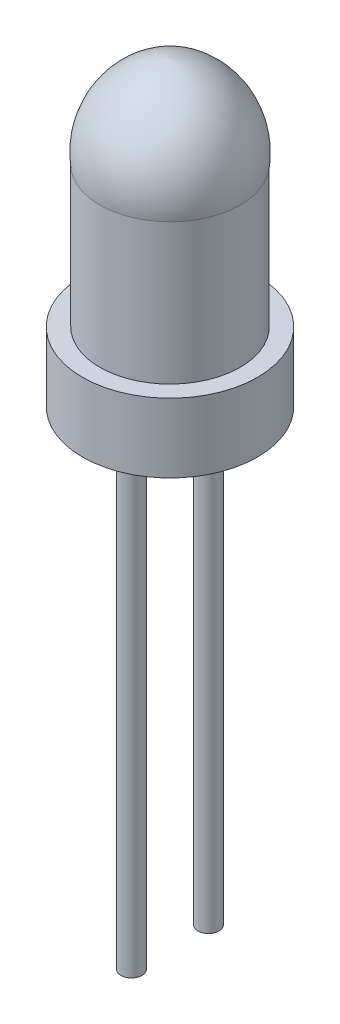
ISO-10303-21;
HEADER;
FILE_DESCRIPTION(('STEP AP214'),'2;1');
FILE_NAME('part.step','',(''),(''),'','','');
FILE_SCHEMA(('AUTOMOTIVE_DESIGN { 1 0 10303 214 1 1 1 1 }'));
ENDSEC;
DATA;
#1=APPLICATION_CONTEXT('core data for automotive mechanical design processes');
#2=APPLICATION_PROTOCOL_DEFINITION('international standard','automotive_design',2000,#1);
#3=PRODUCT_CONTEXT('',#1,'mechanical');
#4=PRODUCT('Part','Part','',(#3));
#5=PRODUCT_RELATED_PRODUCT_CATEGORY('part','',(#4));
#6=PRODUCT_DEFINITION_FORMATION('','',#4);
#7=PRODUCT_DEFINITION_CONTEXT('part definition',#1,'design');
#8=PRODUCT_DEFINITION('design','',#6,#7);
#9=PRODUCT_DEFINITION_SHAPE('','',#8);
#10=(LENGTH_UNIT() NAMED_UNIT(*) SI_UNIT(.MILLI.,.METRE.));
#11=(NAMED_UNIT(*) PLANE_ANGLE_UNIT() SI_UNIT($,.RADIAN.));
#12=(NAMED_UNIT(*) SI_UNIT($,.STERADIAN.) SOLID_ANGLE_UNIT());
#13=UNCERTAINTY_MEASURE_WITH_UNIT(LENGTH_MEASURE(1.E-05),#10,'distance_accuracy_value','');
#14=(GEOMETRIC_REPRESENTATION_CONTEXT(3) GLOBAL_UNCERTAINTY_ASSIGNED_CONTEXT((#13)) GLOBAL_UNIT_ASSIGNED_CONTEXT((#10,
#11,#12)) REPRESENTATION_CONTEXT('',''));
#15=CARTESIAN_POINT('',(0.,0.,0.));
#16=DIRECTION('',(0.,0.,1.));
#17=DIRECTION('',(1.,0.,0.));
#18=AXIS2_PLACEMENT_3D('',#15,#16,#17);
#19=CARTESIAN_POINT('',(0.,0.,0.));
#20=DIRECTION('',(0.,-1.,0.));
#21=DIRECTION('',(0.,0.,-1.));
#22=AXIS2_PLACEMENT_3D('',#19,#20,#21);
#23=PLANE('',#22);
#24=CARTESIAN_POINT('',(0.,0.,0.822285038665882));
#25=DIRECTION('',(0.,-1.,0.));
#26=DIRECTION('',(0.,0.,1.));
#27=AXIS2_PLACEMENT_3D('',#24,#25,#26);
#28=CIRCLE('',#27,0.225118875903263);
#29=CARTESIAN_POINT('',(0.,0.,1.04740391456914));
#30=VERTEX_POINT('',#29);
#31=EDGE_CURVE('E83',#30,#30,#28,.T.);
#32=ORIENTED_EDGE('',*,*,#31,.F.);
#33=EDGE_LOOP('',(#32));
#34=FACE_BOUND('',#33,.T.);
#35=CARTESIAN_POINT('',(0.,0.,-0.822285038665882));
#36=DIRECTION('',(0.,-1.,0.));
#37=DIRECTION('',(0.,0.,-1.));
#38=AXIS2_PLACEMENT_3D('',#35,#36,#37);
#39=CIRCLE('',#38,0.225118875903263);
#40=CARTESIAN_POINT('',(0.,0.,-1.04740391456914));
#41=VERTEX_POINT('',#40);
#42=EDGE_CURVE('E75',#41,#41,#39,.T.);
#43=ORIENTED_EDGE('',*,*,#42,.F.);
#44=EDGE_LOOP('',(#43));
#45=FACE_BOUND('',#44,.T.);
#46=CARTESIAN_POINT('',(0.,0.,0.));
#47=DIRECTION('',(0.,-1.,0.));
#48=DIRECTION('',(0.,0.,-1.));
#49=AXIS2_PLACEMENT_3D('',#46,#47,#48);
#50=CIRCLE('',#49,1.87);
#51=CARTESIAN_POINT('',(0.,0.,-1.87));
#52=VERTEX_POINT('',#51);
#53=EDGE_CURVE('E68',#52,#52,#50,.T.);
#54=ORIENTED_EDGE('',*,*,#53,.T.);
#55=EDGE_LOOP('',(#54));
#56=FACE_BOUND('',#55,.T.);
#57=ADVANCED_FACE('F41',(#34,#45,#56),#23,.T.);
#58=CARTESIAN_POINT('',(0.,4.69893397912577,0.22363052942277));
#59=DIRECTION('',(-1.,0.,0.));
#60=DIRECTION('',(0.,0.,-1.));
#61=AXIS2_PLACEMENT_3D('',#58,#59,#60);
#62=CIRCLE('',#61,1.73807733304595);
#63=TRIMMED_CURVE('',#62,(PARAMETER_VALUE(-1.44177318488154)),
(PARAMETER_VALUE(1.44177318488154)),.T.,.PARAMETER.);
#64=CARTESIAN_POINT('',(0.,4.69893397912577,0.));
#65=DIRECTION('',(0.,-1.,0.));
#66=AXIS1_PLACEMENT('',#64,#65);
#67=SURFACE_OF_REVOLUTION('',#63,#66);
#68=CARTESIAN_POINT('',(0.,6.42256450854854,0.));
#69=VERTEX_POINT('',#68);
#70=VERTEX_LOOP('',#69);
#71=FACE_BOUND('',#70,.T.);
#72=CARTESIAN_POINT('',(0.,4.475303449703,0.));
#73=DIRECTION('',(0.,-1.,0.));
#74=DIRECTION('',(0.,0.,-1.));
#75=AXIS2_PLACEMENT_3D('',#72,#73,#74);
#76=CIRCLE('',#75,1.5);
#77=CARTESIAN_POINT('',(0.,4.475303449703,-1.5));
#78=VERTEX_POINT('',#77);
#79=EDGE_CURVE('E11',#78,#78,#76,.T.);
#80=ORIENTED_EDGE('',*,*,#79,.F.);
#81=EDGE_LOOP('',(#80));
#82=FACE_BOUND('',#81,.T.);
#83=ADVANCED_FACE('F51',(#71,#82),#67,.T.);
#84=CARTESIAN_POINT('',(0.,0.,0.));
#85=DIRECTION('',(0.,-1.,0.));
#86=DIRECTION('',(0.,0.,-1.));
#87=AXIS2_PLACEMENT_3D('',#84,#85,#86);
#88=CYLINDRICAL_SURFACE('',#87,1.5);
#89=ORIENTED_EDGE('',*,*,#79,.T.);
#90=EDGE_LOOP('',(#89));
#91=FACE_BOUND('',#90,.T.);
#92=CARTESIAN_POINT('',(0.,1.475303449703,0.));
#93=DIRECTION('',(0.,-1.,0.));
#94=DIRECTION('',(0.,0.,-1.));
#95=AXIS2_PLACEMENT_3D('',#92,#93,#94);
#96=CIRCLE('',#95,1.5);
#97=CARTESIAN_POINT('',(0.,1.475303449703,-1.5));
#98=VERTEX_POINT('',#97);
#99=EDGE_CURVE('E48',#98,#98,#96,.T.);
#100=ORIENTED_EDGE('',*,*,#99,.F.);
#101=EDGE_LOOP('',(#100));
#102=FACE_BOUND('',#101,.T.);
#103=ADVANCED_FACE('F54',(#91,#102),#88,.T.);
#104=CARTESIAN_POINT('',(1.87,1.475303449703,0.));
#105=DIRECTION('',(0.,1.,0.));
#106=DIRECTION('',(0.,0.,1.));
#107=AXIS2_PLACEMENT_3D('',#104,#105,#106);
#108=PLANE('',#107);
#109=ORIENTED_EDGE('',*,*,#99,.T.);
#110=EDGE_LOOP('',(#109));
#111=FACE_BOUND('',#110,.T.);
#112=CARTESIAN_POINT('',(0.,1.475303449703,0.));
#113=DIRECTION('',(0.,-1.,0.));
#114=DIRECTION('',(0.,0.,-1.));
#115=AXIS2_PLACEMENT_3D('',#112,#113,#114);
#116=CIRCLE('',#115,1.87);
#117=CARTESIAN_POINT('',(0.,1.475303449703,-1.87));
#118=VERTEX_POINT('',#117);
#119=EDGE_CURVE('E65',#118,#118,#116,.T.);
#120=ORIENTED_EDGE('',*,*,#119,.F.);
#121=EDGE_LOOP('',(#120));
#122=FACE_BOUND('',#121,.T.);
#123=ADVANCED_FACE('F59',(#111,#122),#108,.T.);
#124=CARTESIAN_POINT('',(0.,0.,0.));
#125=DIRECTION('',(0.,-1.,0.));
#126=DIRECTION('',(0.,0.,-1.));
#127=AXIS2_PLACEMENT_3D('',#124,#125,#126);
#128=CYLINDRICAL_SURFACE('',#127,1.87);
#129=ORIENTED_EDGE('',*,*,#119,.T.);
#130=EDGE_LOOP('',(#129));
#131=FACE_BOUND('',#130,.T.);
#132=ORIENTED_EDGE('',*,*,#53,.F.);
#133=EDGE_LOOP('',(#132));
#134=FACE_BOUND('',#133,.T.);
#135=ADVANCED_FACE('F106',(#131,#134),#128,.T.);
#136=CARTESIAN_POINT('',(0.,-10.,-0.822285038665882));
#137=DIRECTION('',(0.,1.,0.));
#138=DIRECTION('',(0.,0.,1.));
#139=AXIS2_PLACEMENT_3D('',#136,#137,#138);
#140=CYLINDRICAL_SURFACE('',#139,0.225118875903263);
#141=CARTESIAN_POINT('',(0.,-10.,-0.822285038665882));
#142=DIRECTION('',(0.,-1.,0.));
#143=DIRECTION('',(0.,0.,-1.));
#144=AXIS2_PLACEMENT_3D('',#141,#142,#143);
#145=CIRCLE('',#144,0.225118875903263);
#146=CARTESIAN_POINT('',(0.,-10.,-1.04740391456914));
#147=VERTEX_POINT('',#146);
#148=EDGE_CURVE('E74',#147,#147,#145,.T.);
#149=ORIENTED_EDGE('',*,*,#148,.F.);
#150=EDGE_LOOP('',(#149));
#151=FACE_BOUND('',#150,.T.);
#152=ORIENTED_EDGE('',*,*,#42,.T.);
#153=EDGE_LOOP('',(#152));
#154=FACE_BOUND('',#153,.T.);
#155=ADVANCED_FACE('F108',(#151,#154),#140,.T.);
#156=CARTESIAN_POINT('',(0.,-10.,-0.822285038665882));
#157=DIRECTION('',(0.,-1.,0.));
#158=DIRECTION('',(0.,0.,-1.));
#159=AXIS2_PLACEMENT_3D('',#156,#157,#158);
#160=PLANE('',#159);
#161=ORIENTED_EDGE('',*,*,#148,.T.);
#162=EDGE_LOOP('',(#161));
#163=FACE_BOUND('',#162,.T.);
#164=ADVANCED_FACE('F96',(#163),#160,.T.);
#165=CARTESIAN_POINT('',(0.,-10.,0.822285038665882));
#166=DIRECTION('',(0.,1.,0.));
#167=DIRECTION('',(0.,0.,1.));
#168=AXIS2_PLACEMENT_3D('',#165,#166,#167);
#169=CYLINDRICAL_SURFACE('',#168,0.225118875903263);
#170=CARTESIAN_POINT('',(0.,-10.,0.822285038665882));
#171=DIRECTION('',(0.,-1.,0.));
#172=DIRECTION('',(0.,0.,1.));
#173=AXIS2_PLACEMENT_3D('',#170,#171,#172);
#174=CIRCLE('',#173,0.225118875903263);
#175=CARTESIAN_POINT('',(0.,-10.,1.04740391456914));
#176=VERTEX_POINT('',#175);
#177=EDGE_CURVE('E79',#176,#176,#174,.T.);
#178=ORIENTED_EDGE('',*,*,#177,.F.);
#179=EDGE_LOOP('',(#178));
#180=FACE_BOUND('',#179,.T.);
#181=ORIENTED_EDGE('',*,*,#31,.T.);
#182=EDGE_LOOP('',(#181));
#183=FACE_BOUND('',#182,.T.);
#184=ADVANCED_FACE('F93',(#180,#183),#169,.T.);
#185=CARTESIAN_POINT('',(0.,-10.,0.822285038665882));
#186=DIRECTION('',(0.,1.,0.));
#187=DIRECTION('',(0.,0.,1.));
#188=AXIS2_PLACEMENT_3D('',#185,#186,#187);
#189=PLANE('',#188);
#190=ORIENTED_EDGE('',*,*,#177,.T.);
#191=EDGE_LOOP('',(#190));
#192=FACE_BOUND('',#191,.T.);
#193=ADVANCED_FACE('F91',(#192),#189,.F.);
#194=CLOSED_SHELL('',(#57,#83,#103,#123,#135,#155,#164,#184,#193));
#195=MANIFOLD_SOLID_BREP('B2',#194);
#196=ADVANCED_BREP_SHAPE_REPRESENTATION('',(#18,#195),#14);
#197=SHAPE_DEFINITION_REPRESENTATION(#9,#196);
ENDSEC;
END-ISO-10303-21;
